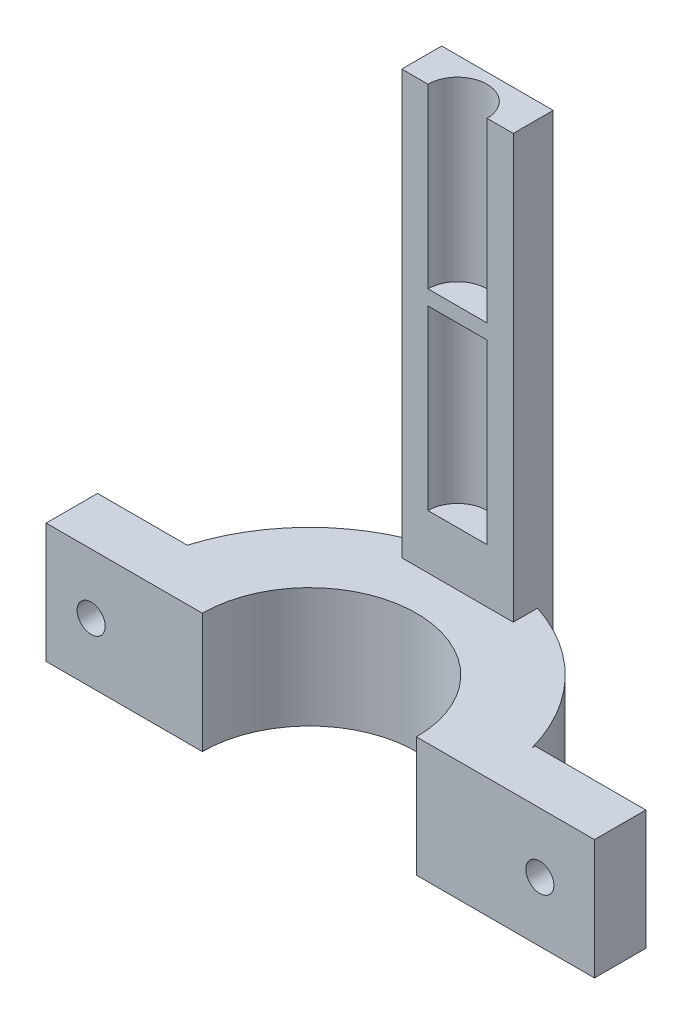
ISO-10303-21;
HEADER;
FILE_DESCRIPTION(('STEP AP214'),'2;1');
FILE_NAME('part.step','',(''),(''),'','','');
FILE_SCHEMA(('AUTOMOTIVE_DESIGN { 1 0 10303 214 1 1 1 1 }'));
ENDSEC;
DATA;
#1=APPLICATION_CONTEXT('core data for automotive mechanical design processes');
#2=APPLICATION_PROTOCOL_DEFINITION('international standard','automotive_design',2000,#1);
#3=PRODUCT_CONTEXT('',#1,'mechanical');
#4=PRODUCT('Part','Part','',(#3));
#5=PRODUCT_RELATED_PRODUCT_CATEGORY('part','',(#4));
#6=PRODUCT_DEFINITION_FORMATION('','',#4);
#7=PRODUCT_DEFINITION_CONTEXT('part definition',#1,'design');
#8=PRODUCT_DEFINITION('design','',#6,#7);
#9=PRODUCT_DEFINITION_SHAPE('','',#8);
#10=(LENGTH_UNIT() NAMED_UNIT(*) SI_UNIT(.MILLI.,.METRE.));
#11=(NAMED_UNIT(*) PLANE_ANGLE_UNIT() SI_UNIT($,.RADIAN.));
#12=(NAMED_UNIT(*) SI_UNIT($,.STERADIAN.) SOLID_ANGLE_UNIT());
#13=UNCERTAINTY_MEASURE_WITH_UNIT(LENGTH_MEASURE(1.E-05),#10,'distance_accuracy_value','');
#14=(GEOMETRIC_REPRESENTATION_CONTEXT(3) GLOBAL_UNCERTAINTY_ASSIGNED_CONTEXT((#13)) GLOBAL_UNIT_ASSIGNED_CONTEXT((#10,
#11,#12)) REPRESENTATION_CONTEXT('',''));
#15=CARTESIAN_POINT('',(0.,0.,0.));
#16=DIRECTION('',(0.,0.,1.));
#17=DIRECTION('',(1.,0.,0.));
#18=AXIS2_PLACEMENT_3D('',#15,#16,#17);
#19=CARTESIAN_POINT('',(-27.351479578733,-58.59,0.));
#20=DIRECTION('',(0.,-1.,0.));
#21=DIRECTION('',(0.,0.,-1.));
#22=AXIS2_PLACEMENT_3D('',#19,#20,#21);
#23=CYLINDRICAL_SURFACE('',#22,24.5);
#24=CARTESIAN_POINT('',(-27.351479578733,-69.769427919111,0.));
#25=DIRECTION('',(0.,1.,0.));
#26=DIRECTION('',(0.,0.,1.));
#27=AXIS2_PLACEMENT_3D('',#24,#25,#26);
#28=CIRCLE('',#27,24.5);
#29=CARTESIAN_POINT('',(-34.8435628196889,-69.769427919111,-23.3263518088575));
#30=VERTEX_POINT('',#29);
#31=CARTESIAN_POINT('',(-19.745,-69.769427919111,-23.2892994402648));
#32=VERTEX_POINT('',#31);
#33=EDGE_CURVE('E350',#30,#32,#28,.F.);
#34=ORIENTED_EDGE('',*,*,#33,.T.);
#35=DIRECTION('',(0.,-1.,0.));
#36=VECTOR('',#35,1.);
#37=CARTESIAN_POINT('',(-19.745,-58.59,-23.2892994402648));
#38=LINE('',#37,#36);
#39=CARTESIAN_POINT('',(-19.745,-58.59,-23.2892994402648));
#40=VERTEX_POINT('',#39);
#41=EDGE_CURVE('E252',#32,#40,#38,.F.);
#42=ORIENTED_EDGE('',*,*,#41,.T.);
#43=CARTESIAN_POINT('',(-27.351479578733,-58.59,0.));
#44=DIRECTION('',(0.,-1.,0.));
#45=DIRECTION('',(1.,0.,0.));
#46=AXIS2_PLACEMENT_3D('',#43,#44,#45);
#47=CIRCLE('',#46,24.5);
#48=CARTESIAN_POINT('',(-3.74499999999999,-58.59,-6.55622771865516));
#49=VERTEX_POINT('',#48);
#50=EDGE_CURVE('E254',#40,#49,#47,.T.);
#51=ORIENTED_EDGE('',*,*,#50,.T.);
#52=DIRECTION('',(0.,-1.,0.));
#53=VECTOR('',#52,1.);
#54=CARTESIAN_POINT('',(-3.745,-58.59,-6.55622771865516));
#55=LINE('',#54,#53);
#56=CARTESIAN_POINT('',(-3.74499999999999,-74.82,-6.55622771865516));
#57=VERTEX_POINT('',#56);
#58=EDGE_CURVE('E269',#57,#49,#55,.F.);
#59=ORIENTED_EDGE('',*,*,#58,.F.);
#60=CARTESIAN_POINT('',(-27.351479578733,-74.82,0.));
#61=DIRECTION('',(0.,-1.,0.));
#62=DIRECTION('',(1.,0.,0.));
#63=AXIS2_PLACEMENT_3D('',#60,#61,#62);
#64=CIRCLE('',#63,24.5);
#65=CARTESIAN_POINT('',(-50.8435628196889,-74.82,-6.95500000000001));
#66=VERTEX_POINT('',#65);
#67=EDGE_CURVE('E278',#66,#57,#64,.T.);
#68=ORIENTED_EDGE('',*,*,#67,.F.);
#69=DIRECTION('',(0.,-1.,0.));
#70=VECTOR('',#69,1.);
#71=CARTESIAN_POINT('',(-50.8435628196889,-58.59,-6.95500000000001));
#72=LINE('',#71,#70);
#73=CARTESIAN_POINT('',(-50.8435628196889,-58.59,-6.95500000000001));
#74=VERTEX_POINT('',#73);
#75=EDGE_CURVE('E264',#74,#66,#72,.T.);
#76=ORIENTED_EDGE('',*,*,#75,.F.);
#77=CARTESIAN_POINT('',(-34.8435628196889,-58.59,-23.3263518088575));
#78=VERTEX_POINT('',#77);
#79=EDGE_CURVE('E295',#74,#78,#47,.T.);
#80=ORIENTED_EDGE('',*,*,#79,.T.);
#81=DIRECTION('',(0.,-1.,0.));
#82=VECTOR('',#81,1.);
#83=CARTESIAN_POINT('',(-34.8435628196889,-58.59,-23.3263518088575));
#84=LINE('',#83,#82);
#85=EDGE_CURVE('E250',#78,#30,#84,.T.);
#86=ORIENTED_EDGE('',*,*,#85,.T.);
#87=EDGE_LOOP('',(#34,#42,#51,#59,#68,#76,#80,#86));
#88=FACE_BOUND('',#87,.T.);
#89=ADVANCED_FACE('F65',(#88),#23,.T.);
#90=CARTESIAN_POINT('',(-3.74499999999999,-58.59,-6.95500000000001));
#91=DIRECTION('',(0.,-1.,0.));
#92=DIRECTION('',(0.,0.,-1.));
#93=AXIS2_PLACEMENT_3D('',#90,#91,#92);
#94=PLANE('',#93);
#95=DIRECTION('',(0.,0.,-1.));
#96=VECTOR('',#95,1.);
#97=CARTESIAN_POINT('',(-19.745,-58.59,-6.95500000000001));
#98=LINE('',#97,#96);
#99=CARTESIAN_POINT('',(-19.745,-58.59,-20.));
#100=VERTEX_POINT('',#99);
#101=EDGE_CURVE('E347',#100,#40,#98,.T.);
#102=ORIENTED_EDGE('',*,*,#101,.F.);
#103=DIRECTION('',(1.,0.,0.));
#104=VECTOR('',#103,1.);
#105=CARTESIAN_POINT('',(-3.74499999999999,-58.59,-20.));
#106=LINE('',#105,#104);
#107=CARTESIAN_POINT('',(-34.8435628196889,-58.59,-20.));
#108=VERTEX_POINT('',#107);
#109=EDGE_CURVE('E258',#108,#100,#106,.T.);
#110=ORIENTED_EDGE('',*,*,#109,.F.);
#111=DIRECTION('',(0.,0.,1.));
#112=VECTOR('',#111,1.);
#113=CARTESIAN_POINT('',(-34.8435628196889,-58.59,-6.95500000000001));
#114=LINE('',#113,#112);
#115=EDGE_CURVE('E344',#78,#108,#114,.T.);
#116=ORIENTED_EDGE('',*,*,#115,.F.);
#117=ORIENTED_EDGE('',*,*,#79,.F.);
#118=DIRECTION('',(1.,0.,0.));
#119=VECTOR('',#118,1.);
#120=CARTESIAN_POINT('',(-63.,-58.59,-6.95500000000001));
#121=LINE('',#120,#119);
#122=CARTESIAN_POINT('',(-63.,-58.59,-6.95500000000001));
#123=VERTEX_POINT('',#122);
#124=EDGE_CURVE('E268',#123,#74,#121,.T.);
#125=ORIENTED_EDGE('',*,*,#124,.F.);
#126=DIRECTION('',(0.,0.,1.));
#127=VECTOR('',#126,1.);
#128=CARTESIAN_POINT('',(-63.,-58.59,-6.95500000000001));
#129=LINE('',#128,#127);
#130=CARTESIAN_POINT('',(-63.,-58.59,0.));
#131=VERTEX_POINT('',#130);
#132=EDGE_CURVE('E317',#123,#131,#129,.T.);
#133=ORIENTED_EDGE('',*,*,#132,.T.);
#134=DIRECTION('',(1.,0.,0.));
#135=VECTOR('',#134,1.);
#136=CARTESIAN_POINT('',(-3.74499999999999,-58.59,0.));
#137=LINE('',#136,#135);
#138=CARTESIAN_POINT('',(-41.851479578733,-58.59,0.));
#139=VERTEX_POINT('',#138);
#140=EDGE_CURVE('E305',#131,#139,#137,.T.);
#141=ORIENTED_EDGE('',*,*,#140,.T.);
#142=CARTESIAN_POINT('',(-27.351479578733,-58.59,0.));
#143=DIRECTION('',(0.,-1.,0.));
#144=DIRECTION('',(0.,0.,-1.));
#145=AXIS2_PLACEMENT_3D('',#142,#143,#144);
#146=CIRCLE('',#145,14.5);
#147=CARTESIAN_POINT('',(-12.851479578733,-58.59,0.));
#148=VERTEX_POINT('',#147);
#149=EDGE_CURVE('E302',#139,#148,#146,.T.);
#150=ORIENTED_EDGE('',*,*,#149,.T.);
#151=CARTESIAN_POINT('',(11.255,-58.59,0.));
#152=VERTEX_POINT('',#151);
#153=EDGE_CURVE('E285',#148,#152,#137,.T.);
#154=ORIENTED_EDGE('',*,*,#153,.T.);
#155=DIRECTION('',(0.,0.,-1.));
#156=VECTOR('',#155,1.);
#157=CARTESIAN_POINT('',(11.255,-58.59,-6.955));
#158=LINE('',#157,#156);
#159=CARTESIAN_POINT('',(11.255,-58.59,-6.955));
#160=VERTEX_POINT('',#159);
#161=EDGE_CURVE('E282',#152,#160,#158,.T.);
#162=ORIENTED_EDGE('',*,*,#161,.T.);
#163=DIRECTION('',(1.,0.,0.));
#164=VECTOR('',#163,1.);
#165=CARTESIAN_POINT('',(-3.74499999999999,-58.59,-6.95500000000001));
#166=LINE('',#165,#164);
#167=CARTESIAN_POINT('',(-3.74499999999999,-58.59,-6.95500000000001));
#168=VERTEX_POINT('',#167);
#169=EDGE_CURVE('E277',#168,#160,#166,.T.);
#170=ORIENTED_EDGE('',*,*,#169,.F.);
#171=DIRECTION('',(0.,0.,-1.));
#172=VECTOR('',#171,1.);
#173=CARTESIAN_POINT('',(-3.74499999999999,-58.59,-6.95500000000001));
#174=LINE('',#173,#172);
#175=EDGE_CURVE('E272',#49,#168,#174,.T.);
#176=ORIENTED_EDGE('',*,*,#175,.F.);
#177=ORIENTED_EDGE('',*,*,#50,.F.);
#178=EDGE_LOOP('',(#102,#110,#116,#117,#125,#133,#141,#150,#154,#162,#170,#176,#177));
#179=FACE_BOUND('',#178,.T.);
#180=ADVANCED_FACE('F374',(#179),#94,.F.);
#181=CARTESIAN_POINT('',(0.,-74.82,0.));
#182=DIRECTION('',(0.,-1.,0.));
#183=DIRECTION('',(0.,0.,-1.));
#184=AXIS2_PLACEMENT_3D('',#181,#182,#183);
#185=PLANE('',#184);
#186=DIRECTION('',(0.,0.,1.));
#187=VECTOR('',#186,1.);
#188=CARTESIAN_POINT('',(11.255,-74.82,-27.));
#189=LINE('',#188,#187);
#190=CARTESIAN_POINT('',(11.255,-74.82,-6.955));
#191=VERTEX_POINT('',#190);
#192=CARTESIAN_POINT('',(11.255,-74.82,0.));
#193=VERTEX_POINT('',#192);
#194=EDGE_CURVE('E298',#191,#193,#189,.T.);
#195=ORIENTED_EDGE('',*,*,#194,.T.);
#196=DIRECTION('',(-1.,0.,0.));
#197=VECTOR('',#196,1.);
#198=CARTESIAN_POINT('',(-63.,-74.82,0.));
#199=LINE('',#198,#197);
#200=CARTESIAN_POINT('',(-12.851479578733,-74.82,0.));
#201=VERTEX_POINT('',#200);
#202=EDGE_CURVE('E337',#193,#201,#199,.T.);
#203=ORIENTED_EDGE('',*,*,#202,.T.);
#204=CARTESIAN_POINT('',(-27.351479578733,-74.82,0.));
#205=DIRECTION('',(0.,-1.,0.));
#206=DIRECTION('',(0.,0.,-1.));
#207=AXIS2_PLACEMENT_3D('',#204,#205,#206);
#208=CIRCLE('',#207,14.5);
#209=CARTESIAN_POINT('',(-41.851479578733,-74.82,0.));
#210=VERTEX_POINT('',#209);
#211=EDGE_CURVE('E292',#210,#201,#208,.T.);
#212=ORIENTED_EDGE('',*,*,#211,.F.);
#213=CARTESIAN_POINT('',(-63.,-74.82,0.));
#214=VERTEX_POINT('',#213);
#215=EDGE_CURVE('E316',#210,#214,#199,.T.);
#216=ORIENTED_EDGE('',*,*,#215,.T.);
#217=DIRECTION('',(0.,0.,-1.));
#218=VECTOR('',#217,1.);
#219=CARTESIAN_POINT('',(-63.,-74.82,-6.95500000000001));
#220=LINE('',#219,#218);
#221=CARTESIAN_POINT('',(-63.,-74.82,-6.95500000000001));
#222=VERTEX_POINT('',#221);
#223=EDGE_CURVE('E314',#214,#222,#220,.T.);
#224=ORIENTED_EDGE('',*,*,#223,.T.);
#225=DIRECTION('',(1.,0.,0.));
#226=VECTOR('',#225,1.);
#227=CARTESIAN_POINT('',(-63.,-74.82,-6.95500000000001));
#228=LINE('',#227,#226);
#229=EDGE_CURVE('E294',#222,#66,#228,.T.);
#230=ORIENTED_EDGE('',*,*,#229,.T.);
#231=ORIENTED_EDGE('',*,*,#67,.T.);
#232=DIRECTION('',(0.,0.,1.));
#233=VECTOR('',#232,1.);
#234=CARTESIAN_POINT('',(-3.74499999999999,-74.82,-6.95500000000001));
#235=LINE('',#234,#233);
#236=CARTESIAN_POINT('',(-3.74499999999999,-74.82,-6.95500000000001));
#237=VERTEX_POINT('',#236);
#238=EDGE_CURVE('E273',#237,#57,#235,.T.);
#239=ORIENTED_EDGE('',*,*,#238,.F.);
#240=DIRECTION('',(1.,0.,0.));
#241=VECTOR('',#240,1.);
#242=CARTESIAN_POINT('',(11.255,-74.82,-6.955));
#243=LINE('',#242,#241);
#244=EDGE_CURVE('E274',#237,#191,#243,.T.);
#245=ORIENTED_EDGE('',*,*,#244,.T.);
#246=EDGE_LOOP('',(#195,#203,#212,#216,#224,#230,#231,#239,#245));
#247=FACE_BOUND('',#246,.T.);
#248=ADVANCED_FACE('F386',(#247),#185,.T.);
#249=CARTESIAN_POINT('',(11.255,-74.82,-6.955));
#250=DIRECTION('',(0.,0.,1.));
#251=DIRECTION('',(1.,0.,0.));
#252=AXIS2_PLACEMENT_3D('',#249,#250,#251);
#253=PLANE('',#252);
#254=CARTESIAN_POINT('',(3.85671364878704,-66.705,-6.955));
#255=DIRECTION('',(0.,0.,-1.));
#256=DIRECTION('',(-1.,0.,0.));
#257=AXIS2_PLACEMENT_3D('',#254,#255,#256);
#258=CIRCLE('',#257,1.9);
#259=CARTESIAN_POINT('',(1.95671364878704,-66.705,-6.955));
#260=VERTEX_POINT('',#259);
#261=EDGE_CURVE('E306',#260,#260,#258,.T.);
#262=ORIENTED_EDGE('',*,*,#261,.F.);
#263=EDGE_LOOP('',(#262));
#264=FACE_BOUND('',#263,.T.);
#265=ORIENTED_EDGE('',*,*,#169,.T.);
#266=DIRECTION('',(0.,-1.,0.));
#267=VECTOR('',#266,1.);
#268=CARTESIAN_POINT('',(11.255,-74.82,-6.955));
#269=LINE('',#268,#267);
#270=EDGE_CURVE('E281',#160,#191,#269,.T.);
#271=ORIENTED_EDGE('',*,*,#270,.T.);
#272=ORIENTED_EDGE('',*,*,#244,.F.);
#273=DIRECTION('',(0.,-1.,0.));
#274=VECTOR('',#273,1.);
#275=CARTESIAN_POINT('',(-3.74499999999999,-74.82,-6.95500000000001));
#276=LINE('',#275,#274);
#277=EDGE_CURVE('E287',#168,#237,#276,.T.);
#278=ORIENTED_EDGE('',*,*,#277,.F.);
#279=EDGE_LOOP('',(#265,#271,#272,#278));
#280=FACE_BOUND('',#279,.T.);
#281=ADVANCED_FACE('F451',(#264,#280),#253,.F.);
#282=CARTESIAN_POINT('',(-3.745,0.,0.));
#283=DIRECTION('',(1.,0.,0.));
#284=DIRECTION('',(0.,0.,-1.));
#285=AXIS2_PLACEMENT_3D('',#282,#283,#284);
#286=PLANE('',#285);
#287=ORIENTED_EDGE('',*,*,#238,.T.);
#288=ORIENTED_EDGE('',*,*,#58,.T.);
#289=ORIENTED_EDGE('',*,*,#175,.T.);
#290=ORIENTED_EDGE('',*,*,#277,.T.);
#291=EDGE_LOOP('',(#287,#288,#289,#290));
#292=FACE_BOUND('',#291,.T.);
#293=ADVANCED_FACE('F378',(#292),#286,.F.);
#294=CARTESIAN_POINT('',(-27.351479578733,-58.59,0.));
#295=DIRECTION('',(0.,-1.,0.));
#296=DIRECTION('',(0.,0.,-1.));
#297=AXIS2_PLACEMENT_3D('',#294,#295,#296);
#298=CYLINDRICAL_SURFACE('',#297,14.5);
#299=ORIENTED_EDGE('',*,*,#211,.T.);
#300=DIRECTION('',(0.,-1.,0.));
#301=VECTOR('',#300,1.);
#302=CARTESIAN_POINT('',(-12.851479578733,-58.59,0.));
#303=LINE('',#302,#301);
#304=EDGE_CURVE('E301',#201,#148,#303,.F.);
#305=ORIENTED_EDGE('',*,*,#304,.T.);
#306=ORIENTED_EDGE('',*,*,#149,.F.);
#307=DIRECTION('',(0.,-1.,0.));
#308=VECTOR('',#307,1.);
#309=CARTESIAN_POINT('',(-41.851479578733,-58.59,0.));
#310=LINE('',#309,#308);
#311=EDGE_CURVE('E326',#139,#210,#310,.T.);
#312=ORIENTED_EDGE('',*,*,#311,.T.);
#313=EDGE_LOOP('',(#299,#305,#306,#312));
#314=FACE_BOUND('',#313,.T.);
#315=ADVANCED_FACE('F419',(#314),#298,.F.);
#316=CARTESIAN_POINT('',(3.85671364878704,-66.705,24.5));
#317=DIRECTION('',(0.,0.,-1.));
#318=DIRECTION('',(-1.,0.,0.));
#319=AXIS2_PLACEMENT_3D('',#316,#317,#318);
#320=CYLINDRICAL_SURFACE('',#319,1.9);
#321=CARTESIAN_POINT('',(3.85671364878704,-66.705,0.));
#322=DIRECTION('',(0.,0.,-1.));
#323=DIRECTION('',(-1.,0.,0.));
#324=AXIS2_PLACEMENT_3D('',#321,#322,#323);
#325=CIRCLE('',#324,1.9);
#326=CARTESIAN_POINT('',(1.95671364878704,-66.705,0.));
#327=VERTEX_POINT('',#326);
#328=EDGE_CURVE('E309',#327,#327,#325,.F.);
#329=ORIENTED_EDGE('',*,*,#328,.T.);
#330=EDGE_LOOP('',(#329));
#331=FACE_BOUND('',#330,.T.);
#332=ORIENTED_EDGE('',*,*,#261,.T.);
#333=EDGE_LOOP('',(#332));
#334=FACE_BOUND('',#333,.T.);
#335=ADVANCED_FACE('F422',(#331,#334),#320,.F.);
#336=CARTESIAN_POINT('',(-63.,-58.59,-6.95500000000001));
#337=DIRECTION('',(0.,0.,-1.));
#338=DIRECTION('',(-1.,0.,0.));
#339=AXIS2_PLACEMENT_3D('',#336,#337,#338);
#340=PLANE('',#339);
#341=CARTESIAN_POINT('',(-56.9080400165376,-66.705,-6.95500000000001));
#342=DIRECTION('',(0.,0.,-1.));
#343=DIRECTION('',(-1.,0.,0.));
#344=AXIS2_PLACEMENT_3D('',#341,#342,#343);
#345=CIRCLE('',#344,1.9);
#346=CARTESIAN_POINT('',(-58.8080400165376,-66.705,-6.95500000000001));
#347=VERTEX_POINT('',#346);
#348=EDGE_CURVE('E259',#347,#347,#345,.T.);
#349=ORIENTED_EDGE('',*,*,#348,.F.);
#350=EDGE_LOOP('',(#349));
#351=FACE_BOUND('',#350,.T.);
#352=ORIENTED_EDGE('',*,*,#124,.T.);
#353=ORIENTED_EDGE('',*,*,#75,.T.);
#354=ORIENTED_EDGE('',*,*,#229,.F.);
#355=DIRECTION('',(0.,1.,0.));
#356=VECTOR('',#355,1.);
#357=CARTESIAN_POINT('',(-63.,-58.59,-6.95500000000001));
#358=LINE('',#357,#356);
#359=EDGE_CURVE('E267',#222,#123,#358,.T.);
#360=ORIENTED_EDGE('',*,*,#359,.T.);
#361=EDGE_LOOP('',(#352,#353,#354,#360));
#362=FACE_BOUND('',#361,.T.);
#363=ADVANCED_FACE('F384',(#351,#362),#340,.T.);
#364=CARTESIAN_POINT('',(-63.,0.,0.));
#365=DIRECTION('',(-1.,0.,0.));
#366=DIRECTION('',(0.,0.,1.));
#367=AXIS2_PLACEMENT_3D('',#364,#365,#366);
#368=PLANE('',#367);
#369=DIRECTION('',(0.,1.,0.));
#370=VECTOR('',#369,1.);
#371=CARTESIAN_POINT('',(-63.,-74.82,0.));
#372=LINE('',#371,#370);
#373=EDGE_CURVE('E263',#214,#131,#372,.T.);
#374=ORIENTED_EDGE('',*,*,#373,.T.);
#375=ORIENTED_EDGE('',*,*,#132,.F.);
#376=ORIENTED_EDGE('',*,*,#359,.F.);
#377=ORIENTED_EDGE('',*,*,#223,.F.);
#378=EDGE_LOOP('',(#374,#375,#376,#377));
#379=FACE_BOUND('',#378,.T.);
#380=ADVANCED_FACE('F390',(#379),#368,.T.);
#381=CARTESIAN_POINT('',(-56.9080400165376,-66.705,24.5));
#382=DIRECTION('',(0.,0.,-1.));
#383=DIRECTION('',(-1.,0.,0.));
#384=AXIS2_PLACEMENT_3D('',#381,#382,#383);
#385=CYLINDRICAL_SURFACE('',#384,1.9);
#386=CARTESIAN_POINT('',(-56.9080400165376,-66.705,0.));
#387=DIRECTION('',(0.,0.,-1.));
#388=DIRECTION('',(-1.,0.,0.));
#389=AXIS2_PLACEMENT_3D('',#386,#387,#388);
#390=CIRCLE('',#389,1.9);
#391=CARTESIAN_POINT('',(-58.8080400165376,-66.705,0.));
#392=VERTEX_POINT('',#391);
#393=EDGE_CURVE('E260',#392,#392,#390,.F.);
#394=ORIENTED_EDGE('',*,*,#393,.T.);
#395=EDGE_LOOP('',(#394));
#396=FACE_BOUND('',#395,.T.);
#397=ORIENTED_EDGE('',*,*,#348,.T.);
#398=EDGE_LOOP('',(#397));
#399=FACE_BOUND('',#398,.T.);
#400=ADVANCED_FACE('F432',(#396,#399),#385,.F.);
#401=CARTESIAN_POINT('',(-63.,-74.82,0.));
#402=DIRECTION('',(0.,0.,-1.));
#403=DIRECTION('',(-1.,0.,0.));
#404=AXIS2_PLACEMENT_3D('',#401,#402,#403);
#405=PLANE('',#404);
#406=ORIENTED_EDGE('',*,*,#393,.F.);
#407=EDGE_LOOP('',(#406));
#408=FACE_BOUND('',#407,.T.);
#409=ORIENTED_EDGE('',*,*,#373,.F.);
#410=ORIENTED_EDGE('',*,*,#215,.F.);
#411=ORIENTED_EDGE('',*,*,#311,.F.);
#412=ORIENTED_EDGE('',*,*,#140,.F.);
#413=EDGE_LOOP('',(#409,#410,#411,#412));
#414=FACE_BOUND('',#413,.T.);
#415=ADVANCED_FACE('F434',(#408,#414),#405,.F.);
#416=ORIENTED_EDGE('',*,*,#328,.F.);
#417=EDGE_LOOP('',(#416));
#418=FACE_BOUND('',#417,.T.);
#419=ORIENTED_EDGE('',*,*,#202,.F.);
#420=DIRECTION('',(0.,1.,0.));
#421=VECTOR('',#420,1.);
#422=CARTESIAN_POINT('',(11.255,-74.82,0.));
#423=LINE('',#422,#421);
#424=EDGE_CURVE('E255',#193,#152,#423,.T.);
#425=ORIENTED_EDGE('',*,*,#424,.T.);
#426=ORIENTED_EDGE('',*,*,#153,.F.);
#427=ORIENTED_EDGE('',*,*,#304,.F.);
#428=EDGE_LOOP('',(#419,#425,#426,#427));
#429=FACE_BOUND('',#428,.T.);
#430=ADVANCED_FACE('F436',(#418,#429),#405,.F.);
#431=CARTESIAN_POINT('',(11.255,-74.82,-27.));
#432=DIRECTION('',(-1.,0.,0.));
#433=DIRECTION('',(0.,0.,1.));
#434=AXIS2_PLACEMENT_3D('',#431,#432,#433);
#435=PLANE('',#434);
#436=ORIENTED_EDGE('',*,*,#161,.F.);
#437=ORIENTED_EDGE('',*,*,#424,.F.);
#438=ORIENTED_EDGE('',*,*,#194,.F.);
#439=ORIENTED_EDGE('',*,*,#270,.F.);
#440=EDGE_LOOP('',(#436,#437,#438,#439));
#441=FACE_BOUND('',#440,.T.);
#442=ADVANCED_FACE('F67',(#441),#435,.F.);
#443=CARTESIAN_POINT('',(0.,0.,-20.));
#444=DIRECTION('',(0.,0.,-1.));
#445=DIRECTION('',(-1.,0.,0.));
#446=AXIS2_PLACEMENT_3D('',#443,#444,#445);
#447=PLANE('',#446);
#448=DIRECTION('',(1.,0.,0.));
#449=VECTOR('',#448,1.);
#450=CARTESIAN_POINT('',(0.,-25.269427919111,-20.));
#451=LINE('',#450,#449);
#452=CARTESIAN_POINT('',(-31.2992814098444,-25.269427919111,-20.));
#453=VERTEX_POINT('',#452);
#454=CARTESIAN_POINT('',(-23.2892814098444,-25.269427919111,-20.));
#455=VERTEX_POINT('',#454);
#456=EDGE_CURVE('E12',#453,#455,#451,.T.);
#457=ORIENTED_EDGE('',*,*,#456,.F.);
#458=DIRECTION('',(0.,1.,0.));
#459=VECTOR('',#458,1.);
#460=CARTESIAN_POINT('',(-31.2992814098444,-25.269427919111,-20.));
#461=LINE('',#460,#459);
#462=CARTESIAN_POINT('',(-31.2992814098445,-1.269427919111,-20.));
#463=VERTEX_POINT('',#462);
#464=EDGE_CURVE('E194',#453,#463,#461,.T.);
#465=ORIENTED_EDGE('',*,*,#464,.T.);
#466=DIRECTION('',(1.,0.,0.));
#467=VECTOR('',#466,1.);
#468=CARTESIAN_POINT('',(-34.8435628196889,-1.269427919111,-20.));
#469=LINE('',#468,#467);
#470=CARTESIAN_POINT('',(-34.8435628196889,-1.269427919111,-20.));
#471=VERTEX_POINT('',#470);
#472=EDGE_CURVE('E217',#471,#463,#469,.T.);
#473=ORIENTED_EDGE('',*,*,#472,.F.);
#474=DIRECTION('',(0.,-1.,0.));
#475=VECTOR('',#474,1.);
#476=CARTESIAN_POINT('',(-34.8435628196889,-27.269427919111,-20.));
#477=LINE('',#476,#475);
#478=EDGE_CURVE('E241',#471,#108,#477,.T.);
#479=ORIENTED_EDGE('',*,*,#478,.T.);
#480=ORIENTED_EDGE('',*,*,#109,.T.);
#481=DIRECTION('',(0.,1.,0.));
#482=VECTOR('',#481,1.);
#483=CARTESIAN_POINT('',(-19.745,-27.269427919111,-20.));
#484=LINE('',#483,#482);
#485=CARTESIAN_POINT('',(-19.745,-1.269427919111,-20.));
#486=VERTEX_POINT('',#485);
#487=EDGE_CURVE('E239',#100,#486,#484,.T.);
#488=ORIENTED_EDGE('',*,*,#487,.T.);
#489=CARTESIAN_POINT('',(-23.2892814098445,-1.269427919111,-20.));
#490=VERTEX_POINT('',#489);
#491=EDGE_CURVE('E211',#490,#486,#469,.T.);
#492=ORIENTED_EDGE('',*,*,#491,.F.);
#493=DIRECTION('',(0.,1.,0.));
#494=VECTOR('',#493,1.);
#495=CARTESIAN_POINT('',(-23.2892814098444,-25.269427919111,-20.));
#496=LINE('',#495,#494);
#497=EDGE_CURVE('E80',#490,#455,#496,.F.);
#498=ORIENTED_EDGE('',*,*,#497,.T.);
#499=EDGE_LOOP('',(#457,#465,#473,#479,#480,#488,#492,#498));
#500=FACE_BOUND('',#499,.T.);
#501=DIRECTION('',(1.,0.,0.));
#502=VECTOR('',#501,1.);
#503=CARTESIAN_POINT('',(0.,-51.269427919111,-20.));
#504=LINE('',#503,#502);
#505=CARTESIAN_POINT('',(-31.2992814098444,-51.269427919111,-20.));
#506=VERTEX_POINT('',#505);
#507=CARTESIAN_POINT('',(-23.2892814098444,-51.269427919111,-20.));
#508=VERTEX_POINT('',#507);
#509=EDGE_CURVE('E355',#506,#508,#504,.T.);
#510=ORIENTED_EDGE('',*,*,#509,.F.);
#511=DIRECTION('',(0.,1.,0.));
#512=VECTOR('',#511,1.);
#513=CARTESIAN_POINT('',(-31.2992814098444,-51.269427919111,-20.));
#514=LINE('',#513,#512);
#515=CARTESIAN_POINT('',(-31.2992814098444,-27.269427919111,-20.));
#516=VERTEX_POINT('',#515);
#517=EDGE_CURVE('E236',#506,#516,#514,.T.);
#518=ORIENTED_EDGE('',*,*,#517,.T.);
#519=DIRECTION('',(1.,0.,0.));
#520=VECTOR('',#519,1.);
#521=CARTESIAN_POINT('',(-34.8435628196889,-27.269427919111,-20.));
#522=LINE('',#521,#520);
#523=CARTESIAN_POINT('',(-23.2892814098444,-27.269427919111,-20.));
#524=VERTEX_POINT('',#523);
#525=EDGE_CURVE('E202',#516,#524,#522,.T.);
#526=ORIENTED_EDGE('',*,*,#525,.T.);
#527=DIRECTION('',(0.,1.,0.));
#528=VECTOR('',#527,1.);
#529=CARTESIAN_POINT('',(-23.2892814098444,-51.269427919111,-20.));
#530=LINE('',#529,#528);
#531=EDGE_CURVE('E233',#524,#508,#530,.F.);
#532=ORIENTED_EDGE('',*,*,#531,.T.);
#533=EDGE_LOOP('',(#510,#518,#526,#532));
#534=FACE_BOUND('',#533,.T.);
#535=ADVANCED_FACE('F207',(#500,#534),#447,.F.);
#536=CARTESIAN_POINT('',(-19.745,-27.269427919111,-20.));
#537=DIRECTION('',(-1.,0.,0.));
#538=DIRECTION('',(0.,-1.,0.));
#539=AXIS2_PLACEMENT_3D('',#536,#537,#538);
#540=PLANE('',#539);
#541=DIRECTION('',(0.,0.,-1.));
#542=VECTOR('',#541,1.);
#543=CARTESIAN_POINT('',(-19.745,-69.769427919111,-20.));
#544=LINE('',#543,#542);
#545=CARTESIAN_POINT('',(-19.745,-69.769427919111,-25.4125470813138));
#546=VERTEX_POINT('',#545);
#547=EDGE_CURVE('E244',#32,#546,#544,.T.);
#548=ORIENTED_EDGE('',*,*,#547,.T.);
#549=DIRECTION('',(0.,1.,0.));
#550=VECTOR('',#549,1.);
#551=CARTESIAN_POINT('',(-19.745,-74.82,-25.4125470813138));
#552=LINE('',#551,#550);
#553=CARTESIAN_POINT('',(-19.745,-1.269427919111,-25.4125470813138));
#554=VERTEX_POINT('',#553);
#555=EDGE_CURVE('E88',#546,#554,#552,.T.);
#556=ORIENTED_EDGE('',*,*,#555,.T.);
#557=DIRECTION('',(0.,0.,-1.));
#558=VECTOR('',#557,1.);
#559=CARTESIAN_POINT('',(-19.745,-1.269427919111,-25.4125470813138));
#560=LINE('',#559,#558);
#561=EDGE_CURVE('E219',#486,#554,#560,.T.);
#562=ORIENTED_EDGE('',*,*,#561,.F.);
#563=ORIENTED_EDGE('',*,*,#487,.F.);
#564=ORIENTED_EDGE('',*,*,#101,.T.);
#565=ORIENTED_EDGE('',*,*,#41,.F.);
#566=EDGE_LOOP('',(#548,#556,#562,#563,#564,#565));
#567=FACE_BOUND('',#566,.T.);
#568=ADVANCED_FACE('F366',(#567),#540,.F.);
#569=CARTESIAN_POINT('',(-34.8435628196889,-27.269427919111,-20.));
#570=DIRECTION('',(1.,0.,0.));
#571=DIRECTION('',(0.,1.,0.));
#572=AXIS2_PLACEMENT_3D('',#569,#570,#571);
#573=PLANE('',#572);
#574=ORIENTED_EDGE('',*,*,#478,.F.);
#575=DIRECTION('',(0.,0.,1.));
#576=VECTOR('',#575,1.);
#577=CARTESIAN_POINT('',(-34.8435628196889,-1.269427919111,-25.4125470813138));
#578=LINE('',#577,#576);
#579=CARTESIAN_POINT('',(-34.8435628196889,-1.269427919111,-25.4125470813138));
#580=VERTEX_POINT('',#579);
#581=EDGE_CURVE('E214',#580,#471,#578,.T.);
#582=ORIENTED_EDGE('',*,*,#581,.F.);
#583=DIRECTION('',(0.,1.,0.));
#584=VECTOR('',#583,1.);
#585=CARTESIAN_POINT('',(-34.8435628196889,-74.82,-25.4125470813138));
#586=LINE('',#585,#584);
#587=CARTESIAN_POINT('',(-34.8435628196889,-69.769427919111,-25.4125470813138));
#588=VERTEX_POINT('',#587);
#589=EDGE_CURVE('E225',#588,#580,#586,.T.);
#590=ORIENTED_EDGE('',*,*,#589,.F.);
#591=DIRECTION('',(0.,0.,-1.));
#592=VECTOR('',#591,1.);
#593=CARTESIAN_POINT('',(-34.8435628196889,-69.769427919111,-20.));
#594=LINE('',#593,#592);
#595=EDGE_CURVE('E247',#30,#588,#594,.T.);
#596=ORIENTED_EDGE('',*,*,#595,.F.);
#597=ORIENTED_EDGE('',*,*,#85,.F.);
#598=ORIENTED_EDGE('',*,*,#115,.T.);
#599=EDGE_LOOP('',(#574,#582,#590,#596,#597,#598));
#600=FACE_BOUND('',#599,.T.);
#601=ADVANCED_FACE('F395',(#600),#573,.F.);
#602=CARTESIAN_POINT('',(-19.745,-69.769427919111,-20.));
#603=DIRECTION('',(0.,1.,0.));
#604=DIRECTION('',(0.,0.,1.));
#605=AXIS2_PLACEMENT_3D('',#602,#603,#604);
#606=PLANE('',#605);
#607=ORIENTED_EDGE('',*,*,#595,.T.);
#608=DIRECTION('',(1.,0.,0.));
#609=VECTOR('',#608,1.);
#610=CARTESIAN_POINT('',(-19.745,-69.769427919111,-25.4125470813138));
#611=LINE('',#610,#609);
#612=EDGE_CURVE('E357',#588,#546,#611,.T.);
#613=ORIENTED_EDGE('',*,*,#612,.T.);
#614=ORIENTED_EDGE('',*,*,#547,.F.);
#615=ORIENTED_EDGE('',*,*,#33,.F.);
#616=EDGE_LOOP('',(#607,#613,#614,#615));
#617=FACE_BOUND('',#616,.T.);
#618=ADVANCED_FACE('F360',(#617),#606,.F.);
#619=CARTESIAN_POINT('',(-27.2942814098444,-51.269427919111,-20.));
#620=DIRECTION('',(0.,1.,0.));
#621=DIRECTION('',(-1.,0.,0.));
#622=AXIS2_PLACEMENT_3D('',#619,#620,#621);
#623=PLANE('',#622);
#624=ORIENTED_EDGE('',*,*,#509,.T.);
#625=CARTESIAN_POINT('',(-27.2942814098444,-51.269427919111,-20.));
#626=DIRECTION('',(0.,1.,0.));
#627=DIRECTION('',(-1.,0.,0.));
#628=AXIS2_PLACEMENT_3D('',#625,#626,#627);
#629=CIRCLE('',#628,4.005);
#630=EDGE_CURVE('E229',#508,#506,#629,.T.);
#631=ORIENTED_EDGE('',*,*,#630,.T.);
#632=EDGE_LOOP('',(#624,#631));
#633=FACE_BOUND('',#632,.T.);
#634=ADVANCED_FACE('F468',(#633),#623,.T.);
#635=CARTESIAN_POINT('',(-27.2942814098444,-51.269427919111,-20.));
#636=DIRECTION('',(0.,1.,0.));
#637=DIRECTION('',(-1.,0.,0.));
#638=AXIS2_PLACEMENT_3D('',#635,#636,#637);
#639=CYLINDRICAL_SURFACE('',#638,4.005);
#640=ORIENTED_EDGE('',*,*,#630,.F.);
#641=ORIENTED_EDGE('',*,*,#531,.F.);
#642=CARTESIAN_POINT('',(-27.2942814098444,-27.269427919111,-20.));
#643=DIRECTION('',(0.,-1.,0.));
#644=DIRECTION('',(1.,0.,0.));
#645=AXIS2_PLACEMENT_3D('',#642,#643,#644);
#646=CIRCLE('',#645,4.005);
#647=EDGE_CURVE('E352',#516,#524,#646,.T.);
#648=ORIENTED_EDGE('',*,*,#647,.F.);
#649=ORIENTED_EDGE('',*,*,#517,.F.);
#650=EDGE_LOOP('',(#640,#641,#648,#649));
#651=FACE_BOUND('',#650,.T.);
#652=ADVANCED_FACE('F471',(#651),#639,.F.);
#653=CARTESIAN_POINT('',(-34.8435628196889,-74.82,-25.4125470813138));
#654=DIRECTION('',(0.,0.,1.));
#655=DIRECTION('',(1.,0.,0.));
#656=AXIS2_PLACEMENT_3D('',#653,#654,#655);
#657=PLANE('',#656);
#658=ORIENTED_EDGE('',*,*,#589,.T.);
#659=DIRECTION('',(-1.,0.,0.));
#660=VECTOR('',#659,1.);
#661=CARTESIAN_POINT('',(-34.8435628196889,-1.269427919111,-25.4125470813138));
#662=LINE('',#661,#660);
#663=EDGE_CURVE('E222',#554,#580,#662,.T.);
#664=ORIENTED_EDGE('',*,*,#663,.F.);
#665=ORIENTED_EDGE('',*,*,#555,.F.);
#666=ORIENTED_EDGE('',*,*,#612,.F.);
#667=EDGE_LOOP('',(#658,#664,#665,#666));
#668=FACE_BOUND('',#667,.T.);
#669=ADVANCED_FACE('F397',(#668),#657,.F.);
#670=CARTESIAN_POINT('',(0.,-27.269427919111,0.));
#671=DIRECTION('',(0.,1.,0.));
#672=DIRECTION('',(-1.,0.,0.));
#673=AXIS2_PLACEMENT_3D('',#670,#671,#672);
#674=PLANE('',#673);
#675=ORIENTED_EDGE('',*,*,#525,.F.);
#676=ORIENTED_EDGE('',*,*,#647,.T.);
#677=EDGE_LOOP('',(#675,#676));
#678=FACE_BOUND('',#677,.T.);
#679=ADVANCED_FACE('F401',(#678),#674,.F.);
#680=CARTESIAN_POINT('',(0.,-1.26942791911099,0.));
#681=DIRECTION('',(0.,1.,0.));
#682=DIRECTION('',(-1.,0.,0.));
#683=AXIS2_PLACEMENT_3D('',#680,#681,#682);
#684=PLANE('',#683);
#685=CARTESIAN_POINT('',(-27.2942814098445,-1.269427919111,-20.));
#686=DIRECTION('',(0.,1.,0.));
#687=DIRECTION('',(-1.,0.,0.));
#688=AXIS2_PLACEMENT_3D('',#685,#686,#687);
#689=CIRCLE('',#688,4.005);
#690=EDGE_CURVE('E73',#490,#463,#689,.T.);
#691=ORIENTED_EDGE('',*,*,#690,.F.);
#692=ORIENTED_EDGE('',*,*,#491,.T.);
#693=ORIENTED_EDGE('',*,*,#561,.T.);
#694=ORIENTED_EDGE('',*,*,#663,.T.);
#695=ORIENTED_EDGE('',*,*,#581,.T.);
#696=ORIENTED_EDGE('',*,*,#472,.T.);
#697=EDGE_LOOP('',(#691,#692,#693,#694,#695,#696));
#698=FACE_BOUND('',#697,.T.);
#699=ADVANCED_FACE('F399',(#698),#684,.T.);
#700=CARTESIAN_POINT('',(-27.2942814098445,-25.269427919111,-20.));
#701=DIRECTION('',(0.,1.,0.));
#702=DIRECTION('',(-1.,0.,0.));
#703=AXIS2_PLACEMENT_3D('',#700,#701,#702);
#704=PLANE('',#703);
#705=ORIENTED_EDGE('',*,*,#456,.T.);
#706=CARTESIAN_POINT('',(-27.2942814098445,-25.269427919111,-20.));
#707=DIRECTION('',(0.,1.,0.));
#708=DIRECTION('',(-1.,0.,0.));
#709=AXIS2_PLACEMENT_3D('',#706,#707,#708);
#710=CIRCLE('',#709,4.005);
#711=EDGE_CURVE('E197',#455,#453,#710,.T.);
#712=ORIENTED_EDGE('',*,*,#711,.T.);
#713=EDGE_LOOP('',(#705,#712));
#714=FACE_BOUND('',#713,.T.);
#715=ADVANCED_FACE('F205',(#714),#704,.T.);
#716=CARTESIAN_POINT('',(-27.2942814098445,-25.269427919111,-20.));
#717=DIRECTION('',(0.,1.,0.));
#718=DIRECTION('',(-1.,0.,0.));
#719=AXIS2_PLACEMENT_3D('',#716,#717,#718);
#720=CYLINDRICAL_SURFACE('',#719,4.005);
#721=ORIENTED_EDGE('',*,*,#711,.F.);
#722=ORIENTED_EDGE('',*,*,#497,.F.);
#723=ORIENTED_EDGE('',*,*,#690,.T.);
#724=ORIENTED_EDGE('',*,*,#464,.F.);
#725=EDGE_LOOP('',(#721,#722,#723,#724));
#726=FACE_BOUND('',#725,.T.);
#727=ADVANCED_FACE('F196',(#726),#720,.F.);
#728=CLOSED_SHELL('',(#89,#180,#248,#281,#293,#315,#335,#363,#380,#400,#415,#430,#442,#535,#568,
#601,#618,#634,#652,#669,#679,#699,#715,#727));
#729=MANIFOLD_SOLID_BREP('B2',#728);
#730=ADVANCED_BREP_SHAPE_REPRESENTATION('',(#18,#729),#14);
#731=SHAPE_DEFINITION_REPRESENTATION(#9,#730);
ENDSEC;
END-ISO-10303-21;
